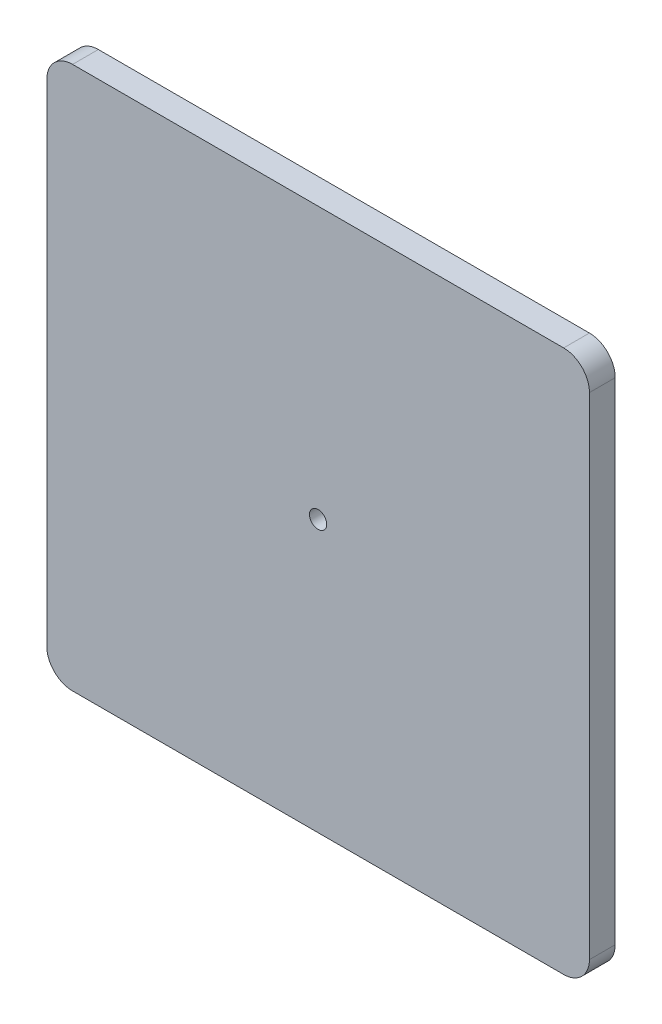
ISO-10303-21;
HEADER;
FILE_DESCRIPTION(('STEP AP214'),'2;1');
FILE_NAME('part.step','',(''),(''),'','','');
FILE_SCHEMA(('AUTOMOTIVE_DESIGN { 1 0 10303 214 1 1 1 1 }'));
ENDSEC;
DATA;
#1=APPLICATION_CONTEXT('core data for automotive mechanical design processes');
#2=APPLICATION_PROTOCOL_DEFINITION('international standard','automotive_design',2000,#1);
#3=PRODUCT_CONTEXT('',#1,'mechanical');
#4=PRODUCT('Part','Part','',(#3));
#5=PRODUCT_RELATED_PRODUCT_CATEGORY('part','',(#4));
#6=PRODUCT_DEFINITION_FORMATION('','',#4);
#7=PRODUCT_DEFINITION_CONTEXT('part definition',#1,'design');
#8=PRODUCT_DEFINITION('design','',#6,#7);
#9=PRODUCT_DEFINITION_SHAPE('','',#8);
#10=(LENGTH_UNIT() NAMED_UNIT(*) SI_UNIT(.MILLI.,.METRE.));
#11=(NAMED_UNIT(*) PLANE_ANGLE_UNIT() SI_UNIT($,.RADIAN.));
#12=(NAMED_UNIT(*) SI_UNIT($,.STERADIAN.) SOLID_ANGLE_UNIT());
#13=UNCERTAINTY_MEASURE_WITH_UNIT(LENGTH_MEASURE(1.E-05),#10,'distance_accuracy_value','');
#14=(GEOMETRIC_REPRESENTATION_CONTEXT(3) GLOBAL_UNCERTAINTY_ASSIGNED_CONTEXT((#13)) GLOBAL_UNIT_ASSIGNED_CONTEXT((#10,
#11,#12)) REPRESENTATION_CONTEXT('',''));
#15=CARTESIAN_POINT('',(0.,0.,0.));
#16=DIRECTION('',(0.,0.,1.));
#17=DIRECTION('',(1.,0.,0.));
#18=AXIS2_PLACEMENT_3D('',#15,#16,#17);
#19=CARTESIAN_POINT('',(100.,100.,9.5));
#20=DIRECTION('',(-1.,0.,0.));
#21=DIRECTION('',(0.,-1.,0.));
#22=AXIS2_PLACEMENT_3D('',#19,#20,#21);
#23=PLANE('',#22);
#24=DIRECTION('',(0.,1.,0.));
#25=VECTOR('',#24,1.);
#26=CARTESIAN_POINT('',(100.,100.,9.5));
#27=LINE('',#26,#25);
#28=CARTESIAN_POINT('',(100.,-90.5,9.5));
#29=VERTEX_POINT('',#28);
#30=CARTESIAN_POINT('',(100.,90.5,9.5));
#31=VERTEX_POINT('',#30);
#32=EDGE_CURVE('E162',#29,#31,#27,.T.);
#33=ORIENTED_EDGE('',*,*,#32,.F.);
#34=DIRECTION('',(0.,0.,-1.));
#35=VECTOR('',#34,1.);
#36=CARTESIAN_POINT('',(100.,-90.5,9.5));
#37=LINE('',#36,#35);
#38=CARTESIAN_POINT('',(100.,-90.5,0.));
#39=VERTEX_POINT('',#38);
#40=EDGE_CURVE('E230',#29,#39,#37,.T.);
#41=ORIENTED_EDGE('',*,*,#40,.T.);
#42=DIRECTION('',(0.,1.,0.));
#43=VECTOR('',#42,1.);
#44=CARTESIAN_POINT('',(100.,100.,0.));
#45=LINE('',#44,#43);
#46=CARTESIAN_POINT('',(100.,90.5,0.));
#47=VERTEX_POINT('',#46);
#48=EDGE_CURVE('E161',#39,#47,#45,.T.);
#49=ORIENTED_EDGE('',*,*,#48,.T.);
#50=DIRECTION('',(0.,0.,-1.));
#51=VECTOR('',#50,1.);
#52=CARTESIAN_POINT('',(100.,90.5,9.5));
#53=LINE('',#52,#51);
#54=EDGE_CURVE('E227',#47,#31,#53,.F.);
#55=ORIENTED_EDGE('',*,*,#54,.T.);
#56=EDGE_LOOP('',(#33,#41,#49,#55));
#57=FACE_BOUND('',#56,.T.);
#58=ADVANCED_FACE('F47',(#57),#23,.F.);
#59=CARTESIAN_POINT('',(-100.,100.,9.5));
#60=DIRECTION('',(0.,-1.,0.));
#61=DIRECTION('',(0.,0.,-1.));
#62=AXIS2_PLACEMENT_3D('',#59,#60,#61);
#63=PLANE('',#62);
#64=DIRECTION('',(-1.,0.,0.));
#65=VECTOR('',#64,1.);
#66=CARTESIAN_POINT('',(-100.,100.,9.5));
#67=LINE('',#66,#65);
#68=CARTESIAN_POINT('',(90.5,100.,9.5));
#69=VERTEX_POINT('',#68);
#70=CARTESIAN_POINT('',(-90.5,100.,9.5));
#71=VERTEX_POINT('',#70);
#72=EDGE_CURVE('E165',#69,#71,#67,.T.);
#73=ORIENTED_EDGE('',*,*,#72,.F.);
#74=DIRECTION('',(0.,0.,-1.));
#75=VECTOR('',#74,1.);
#76=CARTESIAN_POINT('',(90.5,100.,9.5));
#77=LINE('',#76,#75);
#78=CARTESIAN_POINT('',(90.5,100.,0.));
#79=VERTEX_POINT('',#78);
#80=EDGE_CURVE('E11',#69,#79,#77,.T.);
#81=ORIENTED_EDGE('',*,*,#80,.T.);
#82=DIRECTION('',(-1.,0.,0.));
#83=VECTOR('',#82,1.);
#84=CARTESIAN_POINT('',(-100.,100.,0.));
#85=LINE('',#84,#83);
#86=CARTESIAN_POINT('',(-90.5,100.,0.));
#87=VERTEX_POINT('',#86);
#88=EDGE_CURVE('E181',#79,#87,#85,.T.);
#89=ORIENTED_EDGE('',*,*,#88,.T.);
#90=DIRECTION('',(0.,0.,-1.));
#91=VECTOR('',#90,1.);
#92=CARTESIAN_POINT('',(-90.5,100.,9.5));
#93=LINE('',#92,#91);
#94=EDGE_CURVE('E56',#87,#71,#93,.F.);
#95=ORIENTED_EDGE('',*,*,#94,.T.);
#96=EDGE_LOOP('',(#73,#81,#89,#95));
#97=FACE_BOUND('',#96,.T.);
#98=ADVANCED_FACE('F248',(#97),#63,.F.);
#99=CARTESIAN_POINT('',(-100.,100.,9.5));
#100=DIRECTION('',(1.,0.,0.));
#101=DIRECTION('',(0.,1.,0.));
#102=AXIS2_PLACEMENT_3D('',#99,#100,#101);
#103=PLANE('',#102);
#104=DIRECTION('',(0.,-1.,0.));
#105=VECTOR('',#104,1.);
#106=CARTESIAN_POINT('',(-100.,100.,0.));
#107=LINE('',#106,#105);
#108=CARTESIAN_POINT('',(-100.,90.5,0.));
#109=VERTEX_POINT('',#108);
#110=CARTESIAN_POINT('',(-100.,-90.5,0.));
#111=VERTEX_POINT('',#110);
#112=EDGE_CURVE('E184',#109,#111,#107,.T.);
#113=ORIENTED_EDGE('',*,*,#112,.T.);
#114=DIRECTION('',(0.,0.,-1.));
#115=VECTOR('',#114,1.);
#116=CARTESIAN_POINT('',(-100.,-90.5,9.5));
#117=LINE('',#116,#115);
#118=CARTESIAN_POINT('',(-100.,-90.5,9.5));
#119=VERTEX_POINT('',#118);
#120=EDGE_CURVE('E213',#111,#119,#117,.F.);
#121=ORIENTED_EDGE('',*,*,#120,.T.);
#122=DIRECTION('',(0.,-1.,0.));
#123=VECTOR('',#122,1.);
#124=CARTESIAN_POINT('',(-100.,100.,9.5));
#125=LINE('',#124,#123);
#126=CARTESIAN_POINT('',(-100.,90.5,9.5));
#127=VERTEX_POINT('',#126);
#128=EDGE_CURVE('E169',#127,#119,#125,.T.);
#129=ORIENTED_EDGE('',*,*,#128,.F.);
#130=DIRECTION('',(0.,0.,-1.));
#131=VECTOR('',#130,1.);
#132=CARTESIAN_POINT('',(-100.,90.5,9.5));
#133=LINE('',#132,#131);
#134=EDGE_CURVE('E209',#127,#109,#133,.T.);
#135=ORIENTED_EDGE('',*,*,#134,.T.);
#136=EDGE_LOOP('',(#113,#121,#129,#135));
#137=FACE_BOUND('',#136,.T.);
#138=ADVANCED_FACE('F256',(#137),#103,.F.);
#139=CARTESIAN_POINT('',(-100.,-100.,9.5));
#140=DIRECTION('',(0.,1.,0.));
#141=DIRECTION('',(0.,0.,1.));
#142=AXIS2_PLACEMENT_3D('',#139,#140,#141);
#143=PLANE('',#142);
#144=DIRECTION('',(1.,0.,0.));
#145=VECTOR('',#144,1.);
#146=CARTESIAN_POINT('',(-100.,-100.,9.5));
#147=LINE('',#146,#145);
#148=CARTESIAN_POINT('',(-90.5,-100.,9.5));
#149=VERTEX_POINT('',#148);
#150=CARTESIAN_POINT('',(90.5,-100.,9.5));
#151=VERTEX_POINT('',#150);
#152=EDGE_CURVE('E173',#149,#151,#147,.T.);
#153=ORIENTED_EDGE('',*,*,#152,.F.);
#154=DIRECTION('',(0.,0.,-1.));
#155=VECTOR('',#154,1.);
#156=CARTESIAN_POINT('',(-90.5,-100.,9.5));
#157=LINE('',#156,#155);
#158=CARTESIAN_POINT('',(-90.5,-100.,0.));
#159=VERTEX_POINT('',#158);
#160=EDGE_CURVE('E193',#149,#159,#157,.T.);
#161=ORIENTED_EDGE('',*,*,#160,.T.);
#162=DIRECTION('',(1.,0.,0.));
#163=VECTOR('',#162,1.);
#164=CARTESIAN_POINT('',(-100.,-100.,0.));
#165=LINE('',#164,#163);
#166=CARTESIAN_POINT('',(90.5,-100.,0.));
#167=VERTEX_POINT('',#166);
#168=EDGE_CURVE('E166',#159,#167,#165,.T.);
#169=ORIENTED_EDGE('',*,*,#168,.T.);
#170=DIRECTION('',(0.,0.,-1.));
#171=VECTOR('',#170,1.);
#172=CARTESIAN_POINT('',(90.5,-100.,9.5));
#173=LINE('',#172,#171);
#174=EDGE_CURVE('E177',#167,#151,#173,.F.);
#175=ORIENTED_EDGE('',*,*,#174,.T.);
#176=EDGE_LOOP('',(#153,#161,#169,#175));
#177=FACE_BOUND('',#176,.T.);
#178=ADVANCED_FACE('F264',(#177),#143,.F.);
#179=CARTESIAN_POINT('',(0.,0.,9.5));
#180=DIRECTION('',(0.,0.,1.));
#181=DIRECTION('',(1.,0.,0.));
#182=AXIS2_PLACEMENT_3D('',#179,#180,#181);
#183=PLANE('',#182);
#184=CARTESIAN_POINT('',(0.,0.,9.5));
#185=DIRECTION('',(0.,0.,-1.));
#186=DIRECTION('',(-1.,0.,0.));
#187=AXIS2_PLACEMENT_3D('',#184,#185,#186);
#188=CIRCLE('',#187,3.175);
#189=CARTESIAN_POINT('',(-3.175,0.,9.5));
#190=VERTEX_POINT('',#189);
#191=EDGE_CURVE('E157',#190,#190,#188,.T.);
#192=ORIENTED_EDGE('',*,*,#191,.T.);
#193=EDGE_LOOP('',(#192));
#194=FACE_BOUND('',#193,.T.);
#195=ORIENTED_EDGE('',*,*,#128,.T.);
#196=CARTESIAN_POINT('',(-90.5,-90.5,9.5));
#197=DIRECTION('',(0.,0.,1.));
#198=DIRECTION('',(1.,0.,0.));
#199=AXIS2_PLACEMENT_3D('',#196,#197,#198);
#200=CIRCLE('',#199,9.5);
#201=EDGE_CURVE('E224',#119,#149,#200,.T.);
#202=ORIENTED_EDGE('',*,*,#201,.T.);
#203=ORIENTED_EDGE('',*,*,#152,.T.);
#204=CARTESIAN_POINT('',(90.5,-90.5,9.5));
#205=DIRECTION('',(0.,0.,1.));
#206=DIRECTION('',(1.,0.,0.));
#207=AXIS2_PLACEMENT_3D('',#204,#205,#206);
#208=CIRCLE('',#207,9.5);
#209=EDGE_CURVE('E221',#151,#29,#208,.T.);
#210=ORIENTED_EDGE('',*,*,#209,.T.);
#211=ORIENTED_EDGE('',*,*,#32,.T.);
#212=CARTESIAN_POINT('',(90.5,90.5,9.5));
#213=DIRECTION('',(0.,0.,1.));
#214=DIRECTION('',(1.,0.,0.));
#215=AXIS2_PLACEMENT_3D('',#212,#213,#214);
#216=CIRCLE('',#215,9.5);
#217=EDGE_CURVE('E69',#31,#69,#216,.T.);
#218=ORIENTED_EDGE('',*,*,#217,.T.);
#219=ORIENTED_EDGE('',*,*,#72,.T.);
#220=CARTESIAN_POINT('',(-90.5,90.5,9.5));
#221=DIRECTION('',(0.,0.,1.));
#222=DIRECTION('',(1.,0.,0.));
#223=AXIS2_PLACEMENT_3D('',#220,#221,#222);
#224=CIRCLE('',#223,9.5);
#225=EDGE_CURVE('E216',#71,#127,#224,.T.);
#226=ORIENTED_EDGE('',*,*,#225,.T.);
#227=EDGE_LOOP('',(#195,#202,#203,#210,#211,#218,#219,#226));
#228=FACE_BOUND('',#227,.T.);
#229=ADVANCED_FACE('F250',(#194,#228),#183,.T.);
#230=CARTESIAN_POINT('',(0.,0.,0.));
#231=DIRECTION('',(0.,0.,1.));
#232=DIRECTION('',(1.,0.,0.));
#233=AXIS2_PLACEMENT_3D('',#230,#231,#232);
#234=PLANE('',#233);
#235=CARTESIAN_POINT('',(44.5,0.,0.));
#236=DIRECTION('',(0.,0.,-1.));
#237=DIRECTION('',(-1.,0.,0.));
#238=AXIS2_PLACEMENT_3D('',#235,#236,#237);
#239=CIRCLE('',#238,2.619375);
#240=CARTESIAN_POINT('',(41.880625,0.,0.));
#241=VERTEX_POINT('',#240);
#242=EDGE_CURVE('E138',#241,#241,#239,.T.);
#243=ORIENTED_EDGE('',*,*,#242,.F.);
#244=EDGE_LOOP('',(#243));
#245=FACE_BOUND('',#244,.T.);
#246=CARTESIAN_POINT('',(-44.45,0.,0.));
#247=DIRECTION('',(0.,0.,-1.));
#248=DIRECTION('',(-1.,0.,0.));
#249=AXIS2_PLACEMENT_3D('',#246,#247,#248);
#250=CIRCLE('',#249,2.619375);
#251=CARTESIAN_POINT('',(-47.069375,0.,0.));
#252=VERTEX_POINT('',#251);
#253=EDGE_CURVE('E129',#252,#252,#250,.T.);
#254=ORIENTED_EDGE('',*,*,#253,.F.);
#255=EDGE_LOOP('',(#254));
#256=FACE_BOUND('',#255,.T.);
#257=CARTESIAN_POINT('',(0.,0.,0.));
#258=DIRECTION('',(0.,0.,-1.));
#259=DIRECTION('',(-1.,0.,0.));
#260=AXIS2_PLACEMENT_3D('',#257,#258,#259);
#261=CIRCLE('',#260,3.81);
#262=CARTESIAN_POINT('',(-3.81,0.,0.));
#263=VERTEX_POINT('',#262);
#264=EDGE_CURVE('E149',#263,#263,#261,.T.);
#265=ORIENTED_EDGE('',*,*,#264,.F.);
#266=EDGE_LOOP('',(#265));
#267=FACE_BOUND('',#266,.T.);
#268=ORIENTED_EDGE('',*,*,#168,.F.);
#269=CARTESIAN_POINT('',(-90.5,-90.5,0.));
#270=DIRECTION('',(0.,0.,1.));
#271=DIRECTION('',(1.,0.,0.));
#272=AXIS2_PLACEMENT_3D('',#269,#270,#271);
#273=CIRCLE('',#272,9.5);
#274=EDGE_CURVE('E206',#159,#111,#273,.F.);
#275=ORIENTED_EDGE('',*,*,#274,.T.);
#276=ORIENTED_EDGE('',*,*,#112,.F.);
#277=CARTESIAN_POINT('',(-90.5,90.5,0.));
#278=DIRECTION('',(0.,0.,1.));
#279=DIRECTION('',(1.,0.,0.));
#280=AXIS2_PLACEMENT_3D('',#277,#278,#279);
#281=CIRCLE('',#280,9.5);
#282=EDGE_CURVE('E197',#109,#87,#281,.F.);
#283=ORIENTED_EDGE('',*,*,#282,.T.);
#284=ORIENTED_EDGE('',*,*,#88,.F.);
#285=CARTESIAN_POINT('',(90.5,90.5,0.));
#286=DIRECTION('',(0.,0.,1.));
#287=DIRECTION('',(1.,0.,0.));
#288=AXIS2_PLACEMENT_3D('',#285,#286,#287);
#289=CIRCLE('',#288,9.5);
#290=EDGE_CURVE('E200',#79,#47,#289,.F.);
#291=ORIENTED_EDGE('',*,*,#290,.T.);
#292=ORIENTED_EDGE('',*,*,#48,.F.);
#293=CARTESIAN_POINT('',(90.5,-90.5,0.));
#294=DIRECTION('',(0.,0.,1.));
#295=DIRECTION('',(1.,0.,0.));
#296=AXIS2_PLACEMENT_3D('',#293,#294,#295);
#297=CIRCLE('',#296,9.5);
#298=EDGE_CURVE('E203',#39,#167,#297,.F.);
#299=ORIENTED_EDGE('',*,*,#298,.T.);
#300=EDGE_LOOP('',(#268,#275,#276,#283,#284,#291,#292,#299));
#301=FACE_BOUND('',#300,.T.);
#302=ADVANCED_FACE('F243',(#245,#256,#267,#301),#234,.F.);
#303=CARTESIAN_POINT('',(-90.5,-90.5,9.5));
#304=DIRECTION('',(0.,0.,-1.));
#305=DIRECTION('',(-1.,0.,0.));
#306=AXIS2_PLACEMENT_3D('',#303,#304,#305);
#307=CYLINDRICAL_SURFACE('',#306,9.5);
#308=ORIENTED_EDGE('',*,*,#201,.F.);
#309=ORIENTED_EDGE('',*,*,#120,.F.);
#310=ORIENTED_EDGE('',*,*,#274,.F.);
#311=ORIENTED_EDGE('',*,*,#160,.F.);
#312=EDGE_LOOP('',(#308,#309,#310,#311));
#313=FACE_BOUND('',#312,.T.);
#314=ADVANCED_FACE('F261',(#313),#307,.T.);
#315=CARTESIAN_POINT('',(90.5,-90.5,9.5));
#316=DIRECTION('',(0.,0.,-1.));
#317=DIRECTION('',(-1.,0.,0.));
#318=AXIS2_PLACEMENT_3D('',#315,#316,#317);
#319=CYLINDRICAL_SURFACE('',#318,9.5);
#320=ORIENTED_EDGE('',*,*,#209,.F.);
#321=ORIENTED_EDGE('',*,*,#174,.F.);
#322=ORIENTED_EDGE('',*,*,#298,.F.);
#323=ORIENTED_EDGE('',*,*,#40,.F.);
#324=EDGE_LOOP('',(#320,#321,#322,#323));
#325=FACE_BOUND('',#324,.T.);
#326=ADVANCED_FACE('F266',(#325),#319,.T.);
#327=CARTESIAN_POINT('',(90.5,90.5,9.5));
#328=DIRECTION('',(0.,0.,-1.));
#329=DIRECTION('',(-1.,0.,0.));
#330=AXIS2_PLACEMENT_3D('',#327,#328,#329);
#331=CYLINDRICAL_SURFACE('',#330,9.5);
#332=ORIENTED_EDGE('',*,*,#217,.F.);
#333=ORIENTED_EDGE('',*,*,#54,.F.);
#334=ORIENTED_EDGE('',*,*,#290,.F.);
#335=ORIENTED_EDGE('',*,*,#80,.F.);
#336=EDGE_LOOP('',(#332,#333,#334,#335));
#337=FACE_BOUND('',#336,.T.);
#338=ADVANCED_FACE('F247',(#337),#331,.T.);
#339=CARTESIAN_POINT('',(-90.5,90.5,9.5));
#340=DIRECTION('',(0.,0.,-1.));
#341=DIRECTION('',(-1.,0.,0.));
#342=AXIS2_PLACEMENT_3D('',#339,#340,#341);
#343=CYLINDRICAL_SURFACE('',#342,9.5);
#344=ORIENTED_EDGE('',*,*,#225,.F.);
#345=ORIENTED_EDGE('',*,*,#94,.F.);
#346=ORIENTED_EDGE('',*,*,#282,.F.);
#347=ORIENTED_EDGE('',*,*,#134,.F.);
#348=EDGE_LOOP('',(#344,#345,#346,#347));
#349=FACE_BOUND('',#348,.T.);
#350=ADVANCED_FACE('F49',(#349),#343,.T.);
#351=CARTESIAN_POINT('',(0.,0.,0.));
#352=DIRECTION('',(0.,0.,-1.));
#353=DIRECTION('',(-1.,0.,0.));
#354=AXIS2_PLACEMENT_3D('',#351,#352,#353);
#355=CYLINDRICAL_SURFACE('',#354,3.175);
#356=ORIENTED_EDGE('',*,*,#191,.F.);
#357=EDGE_LOOP('',(#356));
#358=FACE_BOUND('',#357,.T.);
#359=CARTESIAN_POINT('',(0.,0.,0.634999999999999));
#360=DIRECTION('',(0.,0.,-1.));
#361=DIRECTION('',(-1.,0.,0.));
#362=AXIS2_PLACEMENT_3D('',#359,#360,#361);
#363=CIRCLE('',#362,3.175);
#364=CARTESIAN_POINT('',(-3.175,0.,0.634999999999999));
#365=VERTEX_POINT('',#364);
#366=EDGE_CURVE('E153',#365,#365,#363,.T.);
#367=ORIENTED_EDGE('',*,*,#366,.T.);
#368=EDGE_LOOP('',(#367));
#369=FACE_BOUND('',#368,.T.);
#370=ADVANCED_FACE('F291',(#358,#369),#355,.F.);
#371=CARTESIAN_POINT('',(0.,0.,0.));
#372=DIRECTION('',(0.,0.,-1.));
#373=DIRECTION('',(-1.,0.,0.));
#374=AXIS2_PLACEMENT_3D('',#371,#372,#373);
#375=CONICAL_SURFACE('',#374,3.81,0.785398163397449);
#376=ORIENTED_EDGE('',*,*,#366,.F.);
#377=EDGE_LOOP('',(#376));
#378=FACE_BOUND('',#377,.T.);
#379=ORIENTED_EDGE('',*,*,#264,.T.);
#380=EDGE_LOOP('',(#379));
#381=FACE_BOUND('',#380,.T.);
#382=ADVANCED_FACE('F294',(#378,#381),#375,.F.);
#383=CARTESIAN_POINT('',(-44.45,0.,6.));
#384=DIRECTION('',(0.,0.,-1.));
#385=DIRECTION('',(-1.,0.,0.));
#386=AXIS2_PLACEMENT_3D('',#383,#384,#385);
#387=CONICAL_SURFACE('',#386,1.984375,1.02974425867665);
#388=CARTESIAN_POINT('',(-44.45,0.,7.19233279088281));
#389=VERTEX_POINT('',#388);
#390=VERTEX_LOOP('',#389);
#391=FACE_BOUND('',#390,.T.);
#392=CARTESIAN_POINT('',(-44.45,0.,6.));
#393=DIRECTION('',(0.,0.,-1.));
#394=DIRECTION('',(-1.,0.,0.));
#395=AXIS2_PLACEMENT_3D('',#392,#393,#394);
#396=CIRCLE('',#395,1.984375);
#397=CARTESIAN_POINT('',(-46.434375,0.,6.));
#398=VERTEX_POINT('',#397);
#399=EDGE_CURVE('E145',#398,#398,#396,.T.);
#400=ORIENTED_EDGE('',*,*,#399,.T.);
#401=EDGE_LOOP('',(#400));
#402=FACE_BOUND('',#401,.T.);
#403=ADVANCED_FACE('F298',(#391,#402),#387,.F.);
#404=CARTESIAN_POINT('',(-44.45,0.,0.));
#405=DIRECTION('',(0.,0.,-1.));
#406=DIRECTION('',(-1.,0.,0.));
#407=AXIS2_PLACEMENT_3D('',#404,#405,#406);
#408=CYLINDRICAL_SURFACE('',#407,1.984375);
#409=ORIENTED_EDGE('',*,*,#399,.F.);
#410=EDGE_LOOP('',(#409));
#411=FACE_BOUND('',#410,.T.);
#412=CARTESIAN_POINT('',(-44.45,0.,0.532828265797572));
#413=DIRECTION('',(0.,0.,-1.));
#414=DIRECTION('',(-1.,0.,0.));
#415=AXIS2_PLACEMENT_3D('',#412,#413,#414);
#416=CIRCLE('',#415,1.984375);
#417=CARTESIAN_POINT('',(-46.434375,0.,0.532828265797572));
#418=VERTEX_POINT('',#417);
#419=EDGE_CURVE('E135',#418,#418,#416,.T.);
#420=ORIENTED_EDGE('',*,*,#419,.T.);
#421=EDGE_LOOP('',(#420));
#422=FACE_BOUND('',#421,.T.);
#423=ADVANCED_FACE('F302',(#411,#422),#408,.F.);
#424=CARTESIAN_POINT('',(-44.45,0.,0.));
#425=DIRECTION('',(0.,0.,-1.));
#426=DIRECTION('',(-1.,0.,0.));
#427=AXIS2_PLACEMENT_3D('',#424,#425,#426);
#428=CONICAL_SURFACE('',#427,2.619375,0.872664625997166);
#429=ORIENTED_EDGE('',*,*,#419,.F.);
#430=EDGE_LOOP('',(#429));
#431=FACE_BOUND('',#430,.T.);
#432=ORIENTED_EDGE('',*,*,#253,.T.);
#433=EDGE_LOOP('',(#432));
#434=FACE_BOUND('',#433,.T.);
#435=ADVANCED_FACE('F122',(#431,#434),#428,.F.);
#436=CARTESIAN_POINT('',(44.5,0.,6.));
#437=DIRECTION('',(0.,0.,-1.));
#438=DIRECTION('',(-1.,0.,0.));
#439=AXIS2_PLACEMENT_3D('',#436,#437,#438);
#440=CONICAL_SURFACE('',#439,1.984375,1.02974425867665);
#441=CARTESIAN_POINT('',(44.5,0.,7.19233279088281));
#442=VERTEX_POINT('',#441);
#443=VERTEX_LOOP('',#442);
#444=FACE_BOUND('',#443,.T.);
#445=CARTESIAN_POINT('',(44.5,0.,6.));
#446=DIRECTION('',(0.,0.,-1.));
#447=DIRECTION('',(-1.,0.,0.));
#448=AXIS2_PLACEMENT_3D('',#445,#446,#447);
#449=CIRCLE('',#448,1.984375);
#450=CARTESIAN_POINT('',(42.515625,0.,6.));
#451=VERTEX_POINT('',#450);
#452=EDGE_CURVE('E126',#451,#451,#449,.T.);
#453=ORIENTED_EDGE('',*,*,#452,.T.);
#454=EDGE_LOOP('',(#453));
#455=FACE_BOUND('',#454,.T.);
#456=ADVANCED_FACE('F118',(#444,#455),#440,.F.);
#457=CARTESIAN_POINT('',(44.5,0.,0.));
#458=DIRECTION('',(0.,0.,-1.));
#459=DIRECTION('',(-1.,0.,0.));
#460=AXIS2_PLACEMENT_3D('',#457,#458,#459);
#461=CYLINDRICAL_SURFACE('',#460,1.984375);
#462=ORIENTED_EDGE('',*,*,#452,.F.);
#463=EDGE_LOOP('',(#462));
#464=FACE_BOUND('',#463,.T.);
#465=CARTESIAN_POINT('',(44.5,0.,0.532828265797572));
#466=DIRECTION('',(0.,0.,-1.));
#467=DIRECTION('',(-1.,0.,0.));
#468=AXIS2_PLACEMENT_3D('',#465,#466,#467);
#469=CIRCLE('',#468,1.984375);
#470=CARTESIAN_POINT('',(42.515625,0.,0.532828265797572));
#471=VERTEX_POINT('',#470);
#472=EDGE_CURVE('E130',#471,#471,#469,.T.);
#473=ORIENTED_EDGE('',*,*,#472,.T.);
#474=EDGE_LOOP('',(#473));
#475=FACE_BOUND('',#474,.T.);
#476=ADVANCED_FACE('F121',(#464,#475),#461,.F.);
#477=CARTESIAN_POINT('',(44.5,0.,0.));
#478=DIRECTION('',(0.,0.,-1.));
#479=DIRECTION('',(-1.,0.,0.));
#480=AXIS2_PLACEMENT_3D('',#477,#478,#479);
#481=CONICAL_SURFACE('',#480,2.619375,0.872664625997166);
#482=ORIENTED_EDGE('',*,*,#472,.F.);
#483=EDGE_LOOP('',(#482));
#484=FACE_BOUND('',#483,.T.);
#485=ORIENTED_EDGE('',*,*,#242,.T.);
#486=EDGE_LOOP('',(#485));
#487=FACE_BOUND('',#486,.T.);
#488=ADVANCED_FACE('F312',(#484,#487),#481,.F.);
#489=CLOSED_SHELL('',(#58,#98,#138,#178,#229,#302,#314,#326,#338,#350,#370,#382,#403,#423,#435,
#456,#476,#488));
#490=MANIFOLD_SOLID_BREP('B2',#489);
#491=ADVANCED_BREP_SHAPE_REPRESENTATION('',(#18,#490),#14);
#492=SHAPE_DEFINITION_REPRESENTATION(#9,#491);
ENDSEC;
END-ISO-10303-21;
